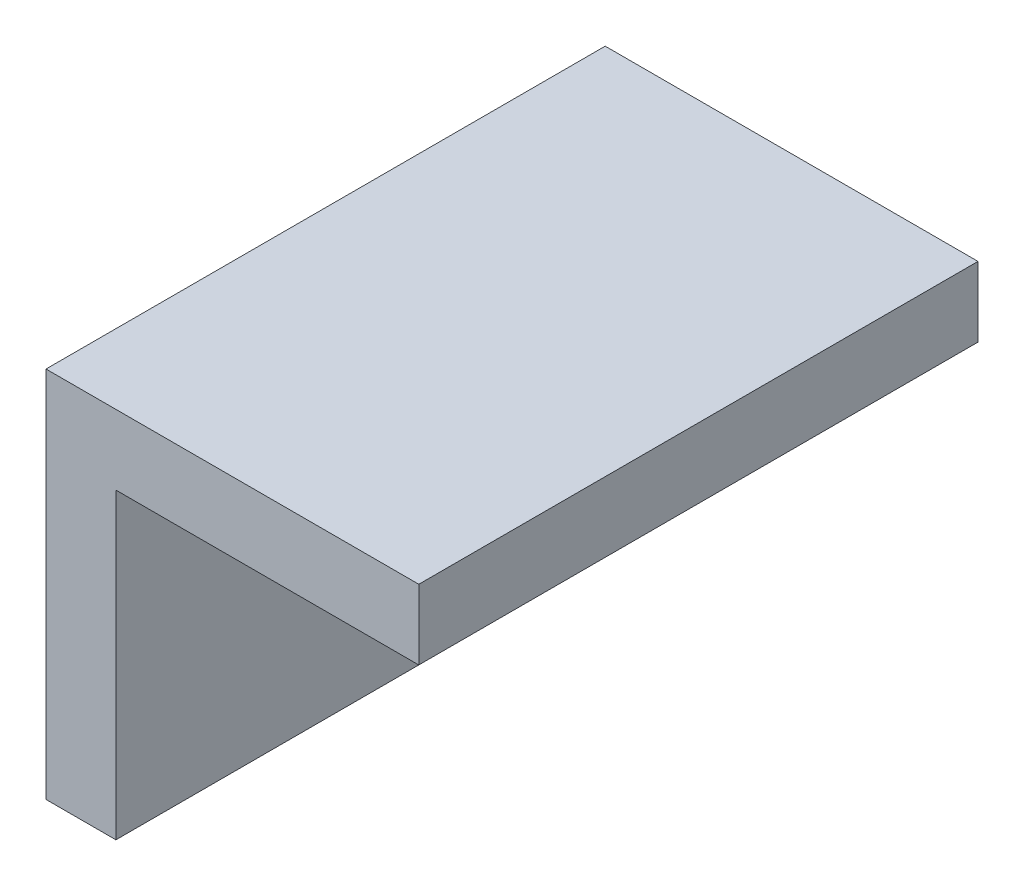
ISO-10303-21;
HEADER;
FILE_DESCRIPTION(('STEP AP214'),'2;1');
FILE_NAME('part.step','',(''),(''),'','','');
FILE_SCHEMA(('AUTOMOTIVE_DESIGN { 1 0 10303 214 1 1 1 1 }'));
ENDSEC;
DATA;
#1=APPLICATION_CONTEXT('core data for automotive mechanical design processes');
#2=APPLICATION_PROTOCOL_DEFINITION('international standard','automotive_design',2000,#1);
#3=PRODUCT_CONTEXT('',#1,'mechanical');
#4=PRODUCT('Part','Part','',(#3));
#5=PRODUCT_RELATED_PRODUCT_CATEGORY('part','',(#4));
#6=PRODUCT_DEFINITION_FORMATION('','',#4);
#7=PRODUCT_DEFINITION_CONTEXT('part definition',#1,'design');
#8=PRODUCT_DEFINITION('design','',#6,#7);
#9=PRODUCT_DEFINITION_SHAPE('','',#8);
#10=(LENGTH_UNIT() NAMED_UNIT(*) SI_UNIT(.MILLI.,.METRE.));
#11=(NAMED_UNIT(*) PLANE_ANGLE_UNIT() SI_UNIT($,.RADIAN.));
#12=(NAMED_UNIT(*) SI_UNIT($,.STERADIAN.) SOLID_ANGLE_UNIT());
#13=UNCERTAINTY_MEASURE_WITH_UNIT(LENGTH_MEASURE(1.E-05),#10,'distance_accuracy_value','');
#14=(GEOMETRIC_REPRESENTATION_CONTEXT(3) GLOBAL_UNCERTAINTY_ASSIGNED_CONTEXT((#13)) GLOBAL_UNIT_ASSIGNED_CONTEXT((#10,
#11,#12)) REPRESENTATION_CONTEXT('',''));
#15=CARTESIAN_POINT('',(0.,0.,0.));
#16=DIRECTION('',(0.,0.,1.));
#17=DIRECTION('',(1.,0.,0.));
#18=AXIS2_PLACEMENT_3D('',#15,#16,#17);
#19=CARTESIAN_POINT('',(0.,0.,76.2));
#20=DIRECTION('',(0.,-1.,0.));
#21=DIRECTION('',(0.,0.,-1.));
#22=AXIS2_PLACEMENT_3D('',#19,#20,#21);
#23=PLANE('',#22);
#24=DIRECTION('',(-1.,0.,0.));
#25=VECTOR('',#24,1.);
#26=CARTESIAN_POINT('',(0.,0.,0.));
#27=LINE('',#26,#25);
#28=CARTESIAN_POINT('',(50.8,0.,0.));
#29=VERTEX_POINT('',#28);
#30=CARTESIAN_POINT('',(0.,0.,0.));
#31=VERTEX_POINT('',#30);
#32=EDGE_CURVE('E121',#29,#31,#27,.T.);
#33=ORIENTED_EDGE('',*,*,#32,.T.);
#34=DIRECTION('',(0.,0.,-1.));
#35=VECTOR('',#34,1.);
#36=CARTESIAN_POINT('',(0.,0.,76.2));
#37=LINE('',#36,#35);
#38=CARTESIAN_POINT('',(0.,0.,76.2));
#39=VERTEX_POINT('',#38);
#40=EDGE_CURVE('E11',#39,#31,#37,.T.);
#41=ORIENTED_EDGE('',*,*,#40,.F.);
#42=DIRECTION('',(-1.,0.,0.));
#43=VECTOR('',#42,1.);
#44=CARTESIAN_POINT('',(0.,0.,76.2));
#45=LINE('',#44,#43);
#46=CARTESIAN_POINT('',(50.8,0.,76.2));
#47=VERTEX_POINT('',#46);
#48=EDGE_CURVE('E131',#47,#39,#45,.T.);
#49=ORIENTED_EDGE('',*,*,#48,.F.);
#50=DIRECTION('',(0.,0.,-1.));
#51=VECTOR('',#50,1.);
#52=CARTESIAN_POINT('',(50.8,0.,76.2));
#53=LINE('',#52,#51);
#54=EDGE_CURVE('E117',#47,#29,#53,.T.);
#55=ORIENTED_EDGE('',*,*,#54,.T.);
#56=EDGE_LOOP('',(#33,#41,#49,#55));
#57=FACE_BOUND('',#56,.T.);
#58=ADVANCED_FACE('F37',(#57),#23,.F.);
#59=CARTESIAN_POINT('',(0.,0.,76.2));
#60=DIRECTION('',(1.,0.,0.));
#61=DIRECTION('',(0.,1.,0.));
#62=AXIS2_PLACEMENT_3D('',#59,#60,#61);
#63=PLANE('',#62);
#64=DIRECTION('',(0.,-1.,0.));
#65=VECTOR('',#64,1.);
#66=CARTESIAN_POINT('',(0.,0.,0.));
#67=LINE('',#66,#65);
#68=CARTESIAN_POINT('',(0.,-50.8,0.));
#69=VERTEX_POINT('',#68);
#70=EDGE_CURVE('E124',#31,#69,#67,.T.);
#71=ORIENTED_EDGE('',*,*,#70,.T.);
#72=DIRECTION('',(0.,0.,-1.));
#73=VECTOR('',#72,1.);
#74=CARTESIAN_POINT('',(0.,-50.8,76.2));
#75=LINE('',#74,#73);
#76=CARTESIAN_POINT('',(0.,-50.8,76.2));
#77=VERTEX_POINT('',#76);
#78=EDGE_CURVE('E45',#77,#69,#75,.T.);
#79=ORIENTED_EDGE('',*,*,#78,.F.);
#80=DIRECTION('',(0.,-1.,0.));
#81=VECTOR('',#80,1.);
#82=CARTESIAN_POINT('',(0.,0.,76.2));
#83=LINE('',#82,#81);
#84=EDGE_CURVE('E90',#39,#77,#83,.T.);
#85=ORIENTED_EDGE('',*,*,#84,.F.);
#86=ORIENTED_EDGE('',*,*,#40,.T.);
#87=EDGE_LOOP('',(#71,#79,#85,#86));
#88=FACE_BOUND('',#87,.T.);
#89=ADVANCED_FACE('F155',(#88),#63,.F.);
#90=CARTESIAN_POINT('',(9.525,-50.8,76.2));
#91=DIRECTION('',(0.,1.,0.));
#92=DIRECTION('',(0.,0.,1.));
#93=AXIS2_PLACEMENT_3D('',#90,#91,#92);
#94=PLANE('',#93);
#95=DIRECTION('',(1.,0.,0.));
#96=VECTOR('',#95,1.);
#97=CARTESIAN_POINT('',(9.525,-50.8,0.));
#98=LINE('',#97,#96);
#99=CARTESIAN_POINT('',(9.525,-50.8,0.));
#100=VERTEX_POINT('',#99);
#101=EDGE_CURVE('E126',#69,#100,#98,.T.);
#102=ORIENTED_EDGE('',*,*,#101,.T.);
#103=DIRECTION('',(0.,0.,-1.));
#104=VECTOR('',#103,1.);
#105=CARTESIAN_POINT('',(9.525,-50.8,76.2));
#106=LINE('',#105,#104);
#107=CARTESIAN_POINT('',(9.525,-50.8,76.2));
#108=VERTEX_POINT('',#107);
#109=EDGE_CURVE('E112',#108,#100,#106,.T.);
#110=ORIENTED_EDGE('',*,*,#109,.F.);
#111=DIRECTION('',(1.,0.,0.));
#112=VECTOR('',#111,1.);
#113=CARTESIAN_POINT('',(9.525,-50.8,76.2));
#114=LINE('',#113,#112);
#115=EDGE_CURVE('E103',#77,#108,#114,.T.);
#116=ORIENTED_EDGE('',*,*,#115,.F.);
#117=ORIENTED_EDGE('',*,*,#78,.T.);
#118=EDGE_LOOP('',(#102,#110,#116,#117));
#119=FACE_BOUND('',#118,.T.);
#120=ADVANCED_FACE('F137',(#119),#94,.F.);
#121=CARTESIAN_POINT('',(9.525,-9.525,76.2));
#122=DIRECTION('',(-1.,0.,0.));
#123=DIRECTION('',(0.,0.,1.));
#124=AXIS2_PLACEMENT_3D('',#121,#122,#123);
#125=PLANE('',#124);
#126=DIRECTION('',(0.,1.,0.));
#127=VECTOR('',#126,1.);
#128=CARTESIAN_POINT('',(9.525,-9.525,0.));
#129=LINE('',#128,#127);
#130=CARTESIAN_POINT('',(9.525,-9.525,0.));
#131=VERTEX_POINT('',#130);
#132=EDGE_CURVE('E111',#100,#131,#129,.T.);
#133=ORIENTED_EDGE('',*,*,#132,.T.);
#134=DIRECTION('',(0.,0.,-1.));
#135=VECTOR('',#134,1.);
#136=CARTESIAN_POINT('',(9.525,-9.525,76.2));
#137=LINE('',#136,#135);
#138=CARTESIAN_POINT('',(9.525,-9.525,76.2));
#139=VERTEX_POINT('',#138);
#140=EDGE_CURVE('E108',#139,#131,#137,.T.);
#141=ORIENTED_EDGE('',*,*,#140,.F.);
#142=DIRECTION('',(0.,1.,0.));
#143=VECTOR('',#142,1.);
#144=CARTESIAN_POINT('',(9.525,-9.525,76.2));
#145=LINE('',#144,#143);
#146=EDGE_CURVE('E97',#108,#139,#145,.T.);
#147=ORIENTED_EDGE('',*,*,#146,.F.);
#148=ORIENTED_EDGE('',*,*,#109,.T.);
#149=EDGE_LOOP('',(#133,#141,#147,#148));
#150=FACE_BOUND('',#149,.T.);
#151=ADVANCED_FACE('F109',(#150),#125,.F.);
#152=CARTESIAN_POINT('',(9.525,-9.525,76.2));
#153=DIRECTION('',(0.,1.,0.));
#154=DIRECTION('',(0.,0.,1.));
#155=AXIS2_PLACEMENT_3D('',#152,#153,#154);
#156=PLANE('',#155);
#157=DIRECTION('',(1.,0.,0.));
#158=VECTOR('',#157,1.);
#159=CARTESIAN_POINT('',(9.525,-9.525,0.));
#160=LINE('',#159,#158);
#161=CARTESIAN_POINT('',(50.8,-9.525,0.));
#162=VERTEX_POINT('',#161);
#163=EDGE_CURVE('E76',#131,#162,#160,.T.);
#164=ORIENTED_EDGE('',*,*,#163,.T.);
#165=DIRECTION('',(0.,0.,-1.));
#166=VECTOR('',#165,1.);
#167=CARTESIAN_POINT('',(50.8,-9.525,76.2));
#168=LINE('',#167,#166);
#169=CARTESIAN_POINT('',(50.8,-9.525,76.2));
#170=VERTEX_POINT('',#169);
#171=EDGE_CURVE('E113',#170,#162,#168,.T.);
#172=ORIENTED_EDGE('',*,*,#171,.F.);
#173=DIRECTION('',(1.,0.,0.));
#174=VECTOR('',#173,1.);
#175=CARTESIAN_POINT('',(9.525,-9.525,76.2));
#176=LINE('',#175,#174);
#177=EDGE_CURVE('E101',#139,#170,#176,.T.);
#178=ORIENTED_EDGE('',*,*,#177,.F.);
#179=ORIENTED_EDGE('',*,*,#140,.T.);
#180=EDGE_LOOP('',(#164,#172,#178,#179));
#181=FACE_BOUND('',#180,.T.);
#182=ADVANCED_FACE('F115',(#181),#156,.F.);
#183=CARTESIAN_POINT('',(50.8,-9.525,76.2));
#184=DIRECTION('',(-1.,0.,0.));
#185=DIRECTION('',(0.,0.,1.));
#186=AXIS2_PLACEMENT_3D('',#183,#184,#185);
#187=PLANE('',#186);
#188=DIRECTION('',(0.,1.,0.));
#189=VECTOR('',#188,1.);
#190=CARTESIAN_POINT('',(50.8,-9.525,0.));
#191=LINE('',#190,#189);
#192=EDGE_CURVE('E82',#162,#29,#191,.T.);
#193=ORIENTED_EDGE('',*,*,#192,.T.);
#194=ORIENTED_EDGE('',*,*,#54,.F.);
#195=DIRECTION('',(0.,1.,0.));
#196=VECTOR('',#195,1.);
#197=CARTESIAN_POINT('',(50.8,-9.525,76.2));
#198=LINE('',#197,#196);
#199=EDGE_CURVE('E53',#170,#47,#198,.T.);
#200=ORIENTED_EDGE('',*,*,#199,.F.);
#201=ORIENTED_EDGE('',*,*,#171,.T.);
#202=EDGE_LOOP('',(#193,#194,#200,#201));
#203=FACE_BOUND('',#202,.T.);
#204=ADVANCED_FACE('F144',(#203),#187,.F.);
#205=CARTESIAN_POINT('',(0.,0.,76.2));
#206=DIRECTION('',(0.,0.,1.));
#207=DIRECTION('',(1.,0.,0.));
#208=AXIS2_PLACEMENT_3D('',#205,#206,#207);
#209=PLANE('',#208);
#210=ORIENTED_EDGE('',*,*,#48,.T.);
#211=ORIENTED_EDGE('',*,*,#84,.T.);
#212=ORIENTED_EDGE('',*,*,#115,.T.);
#213=ORIENTED_EDGE('',*,*,#146,.T.);
#214=ORIENTED_EDGE('',*,*,#177,.T.);
#215=ORIENTED_EDGE('',*,*,#199,.T.);
#216=EDGE_LOOP('',(#210,#211,#212,#213,#214,#215));
#217=FACE_BOUND('',#216,.T.);
#218=ADVANCED_FACE('F99',(#217),#209,.T.);
#219=CARTESIAN_POINT('',(0.,0.,0.));
#220=DIRECTION('',(0.,0.,1.));
#221=DIRECTION('',(1.,0.,0.));
#222=AXIS2_PLACEMENT_3D('',#219,#220,#221);
#223=PLANE('',#222);
#224=ORIENTED_EDGE('',*,*,#32,.F.);
#225=ORIENTED_EDGE('',*,*,#192,.F.);
#226=ORIENTED_EDGE('',*,*,#163,.F.);
#227=ORIENTED_EDGE('',*,*,#132,.F.);
#228=ORIENTED_EDGE('',*,*,#101,.F.);
#229=ORIENTED_EDGE('',*,*,#70,.F.);
#230=EDGE_LOOP('',(#224,#225,#226,#227,#228,#229));
#231=FACE_BOUND('',#230,.T.);
#232=ADVANCED_FACE('F140',(#231),#223,.F.);
#233=CLOSED_SHELL('',(#58,#89,#120,#151,#182,#204,#218,#232));
#234=MANIFOLD_SOLID_BREP('B2',#233);
#235=ADVANCED_BREP_SHAPE_REPRESENTATION('',(#18,#234),#14);
#236=SHAPE_DEFINITION_REPRESENTATION(#9,#235);
ENDSEC;
END-ISO-10303-21;
